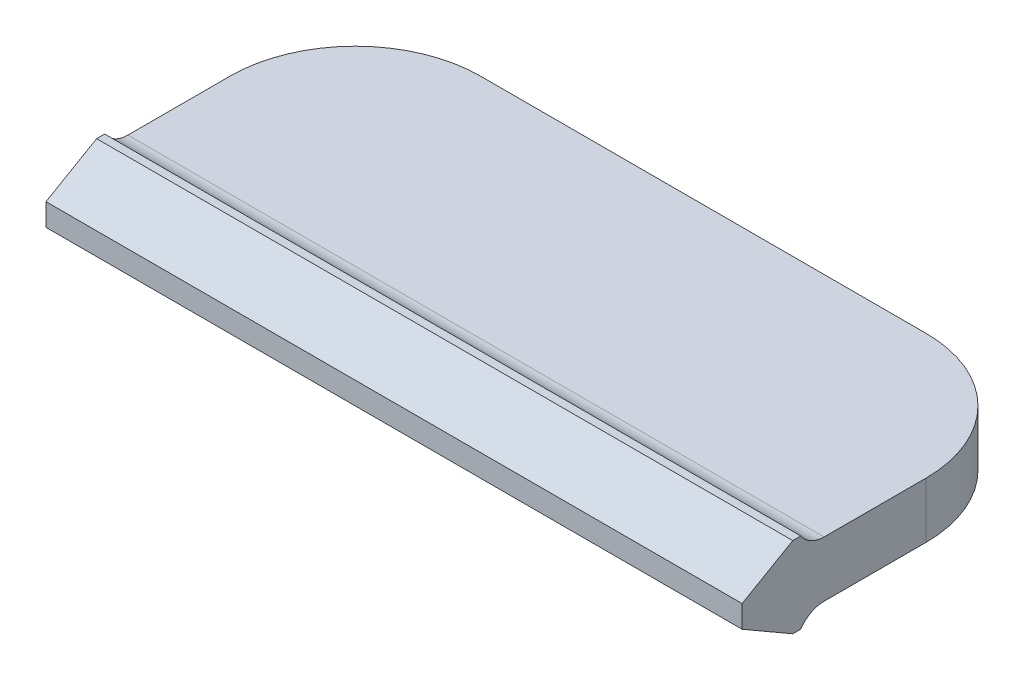
ISO-10303-21;
HEADER;
FILE_DESCRIPTION(('STEP AP214'),'2;1');
FILE_NAME('part.step','',(''),(''),'','','');
FILE_SCHEMA(('AUTOMOTIVE_DESIGN { 1 0 10303 214 1 1 1 1 }'));
ENDSEC;
DATA;
#1=APPLICATION_CONTEXT('core data for automotive mechanical design processes');
#2=APPLICATION_PROTOCOL_DEFINITION('international standard','automotive_design',2000,#1);
#3=PRODUCT_CONTEXT('',#1,'mechanical');
#4=PRODUCT('Part','Part','',(#3));
#5=PRODUCT_RELATED_PRODUCT_CATEGORY('part','',(#4));
#6=PRODUCT_DEFINITION_FORMATION('','',#4);
#7=PRODUCT_DEFINITION_CONTEXT('part definition',#1,'design');
#8=PRODUCT_DEFINITION('design','',#6,#7);
#9=PRODUCT_DEFINITION_SHAPE('','',#8);
#10=(LENGTH_UNIT() NAMED_UNIT(*) SI_UNIT(.MILLI.,.METRE.));
#11=(NAMED_UNIT(*) PLANE_ANGLE_UNIT() SI_UNIT($,.RADIAN.));
#12=(NAMED_UNIT(*) SI_UNIT($,.STERADIAN.) SOLID_ANGLE_UNIT());
#13=UNCERTAINTY_MEASURE_WITH_UNIT(LENGTH_MEASURE(1.E-05),#10,'distance_accuracy_value','');
#14=(GEOMETRIC_REPRESENTATION_CONTEXT(3) GLOBAL_UNCERTAINTY_ASSIGNED_CONTEXT((#13)) GLOBAL_UNIT_ASSIGNED_CONTEXT((#10,
#11,#12)) REPRESENTATION_CONTEXT('',''));
#15=CARTESIAN_POINT('',(0.,0.,0.));
#16=DIRECTION('',(0.,0.,1.));
#17=DIRECTION('',(1.,0.,0.));
#18=AXIS2_PLACEMENT_3D('',#15,#16,#17);
#19=CARTESIAN_POINT('',(25.,0.4,2.10717967697244));
#20=DIRECTION('',(0.,0.,-1.));
#21=DIRECTION('',(0.,1.,0.));
#22=AXIS2_PLACEMENT_3D('',#19,#20,#21);
#23=PLANE('',#22);
#24=DIRECTION('',(0.,-1.,0.));
#25=VECTOR('',#24,1.);
#26=CARTESIAN_POINT('',(0.,0.4,2.10717967697244));
#27=LINE('',#26,#25);
#28=CARTESIAN_POINT('',(0.,0.4,2.10717967697244));
#29=VERTEX_POINT('',#28);
#30=CARTESIAN_POINT('',(0.,-0.4,2.10717967697244));
#31=VERTEX_POINT('',#30);
#32=EDGE_CURVE('E141',#29,#31,#27,.T.);
#33=ORIENTED_EDGE('',*,*,#32,.T.);
#34=DIRECTION('',(-1.,0.,0.));
#35=VECTOR('',#34,1.);
#36=CARTESIAN_POINT('',(25.,-0.4,2.10717967697244));
#37=LINE('',#36,#35);
#38=CARTESIAN_POINT('',(25.,-0.4,2.10717967697244));
#39=VERTEX_POINT('',#38);
#40=EDGE_CURVE('E123',#39,#31,#37,.T.);
#41=ORIENTED_EDGE('',*,*,#40,.F.);
#42=DIRECTION('',(0.,-1.,0.));
#43=VECTOR('',#42,1.);
#44=CARTESIAN_POINT('',(25.,0.4,2.10717967697244));
#45=LINE('',#44,#43);
#46=CARTESIAN_POINT('',(25.,0.4,2.10717967697244));
#47=VERTEX_POINT('',#46);
#48=EDGE_CURVE('E129',#47,#39,#45,.T.);
#49=ORIENTED_EDGE('',*,*,#48,.F.);
#50=DIRECTION('',(-1.,0.,0.));
#51=VECTOR('',#50,1.);
#52=CARTESIAN_POINT('',(25.,0.4,2.10717967697244));
#53=LINE('',#52,#51);
#54=EDGE_CURVE('E200',#47,#29,#53,.T.);
#55=ORIENTED_EDGE('',*,*,#54,.T.);
#56=EDGE_LOOP('',(#33,#41,#49,#55));
#57=FACE_BOUND('',#56,.T.);
#58=ADVANCED_FACE('F32',(#57),#23,.F.);
#59=CARTESIAN_POINT('',(25.,-0.4,2.10717967697244));
#60=DIRECTION('',(0.,0.86602540378444,-0.499999999999998));
#61=DIRECTION('',(0.,0.499999999999998,0.86602540378444));
#62=AXIS2_PLACEMENT_3D('',#59,#60,#61);
#63=PLANE('',#62);
#64=DIRECTION('',(0.,-0.499999999999998,-0.86602540378444));
#65=VECTOR('',#64,1.);
#66=CARTESIAN_POINT('',(0.,-0.4,2.10717967697244));
#67=LINE('',#66,#65);
#68=CARTESIAN_POINT('',(0.,-1.45,0.288526329025113));
#69=VERTEX_POINT('',#68);
#70=EDGE_CURVE('E185',#31,#69,#67,.T.);
#71=ORIENTED_EDGE('',*,*,#70,.T.);
#72=DIRECTION('',(-1.,0.,0.));
#73=VECTOR('',#72,1.);
#74=CARTESIAN_POINT('',(25.,-1.45,0.288526329025113));
#75=LINE('',#74,#73);
#76=CARTESIAN_POINT('',(25.,-1.45,0.288526329025113));
#77=VERTEX_POINT('',#76);
#78=EDGE_CURVE('E126',#77,#69,#75,.T.);
#79=ORIENTED_EDGE('',*,*,#78,.F.);
#80=DIRECTION('',(0.,-0.499999999999998,-0.86602540378444));
#81=VECTOR('',#80,1.);
#82=CARTESIAN_POINT('',(25.,-0.4,2.10717967697244));
#83=LINE('',#82,#81);
#84=EDGE_CURVE('E119',#39,#77,#83,.T.);
#85=ORIENTED_EDGE('',*,*,#84,.F.);
#86=ORIENTED_EDGE('',*,*,#40,.T.);
#87=EDGE_LOOP('',(#71,#79,#85,#86));
#88=FACE_BOUND('',#87,.T.);
#89=ADVANCED_FACE('F121',(#88),#63,.F.);
#90=CARTESIAN_POINT('',(25.,-1.45,0.288526329025113));
#91=DIRECTION('',(0.,1.,0.));
#92=DIRECTION('',(0.,0.,1.));
#93=AXIS2_PLACEMENT_3D('',#90,#91,#92);
#94=PLANE('',#93);
#95=DIRECTION('',(0.,0.,-1.));
#96=VECTOR('',#95,1.);
#97=CARTESIAN_POINT('',(0.,-1.45,0.288526329025113));
#98=LINE('',#97,#96);
#99=CARTESIAN_POINT('',(0.,-1.45,0.));
#100=VERTEX_POINT('',#99);
#101=EDGE_CURVE('E180',#69,#100,#98,.T.);
#102=ORIENTED_EDGE('',*,*,#101,.T.);
#103=DIRECTION('',(-1.,0.,0.));
#104=VECTOR('',#103,1.);
#105=CARTESIAN_POINT('',(25.,-1.45,0.));
#106=LINE('',#105,#104);
#107=CARTESIAN_POINT('',(25.,-1.45,0.));
#108=VERTEX_POINT('',#107);
#109=EDGE_CURVE('E147',#108,#100,#106,.T.);
#110=ORIENTED_EDGE('',*,*,#109,.F.);
#111=DIRECTION('',(0.,0.,-1.));
#112=VECTOR('',#111,1.);
#113=CARTESIAN_POINT('',(25.,-1.45,0.288526329025113));
#114=LINE('',#113,#112);
#115=EDGE_CURVE('E128',#77,#108,#114,.T.);
#116=ORIENTED_EDGE('',*,*,#115,.F.);
#117=ORIENTED_EDGE('',*,*,#78,.T.);
#118=EDGE_LOOP('',(#102,#110,#116,#117));
#119=FACE_BOUND('',#118,.T.);
#120=ADVANCED_FACE('F184',(#119),#94,.F.);
#121=CARTESIAN_POINT('',(25.,-1.,0.));
#122=DIRECTION('',(0.,1.,0.));
#123=DIRECTION('',(0.,0.,1.));
#124=AXIS2_PLACEMENT_3D('',#121,#122,#123);
#125=PLANE('',#124);
#126=DIRECTION('',(0.,0.,-1.));
#127=VECTOR('',#126,1.);
#128=CARTESIAN_POINT('',(25.,-1.,0.));
#129=LINE('',#128,#127);
#130=CARTESIAN_POINT('',(25.,-1.,-0.835164654424503));
#131=VERTEX_POINT('',#130);
#132=CARTESIAN_POINT('',(25.,-1.,-4.5));
#133=VERTEX_POINT('',#132);
#134=EDGE_CURVE('E217',#131,#133,#129,.T.);
#135=ORIENTED_EDGE('',*,*,#134,.F.);
#136=DIRECTION('',(-1.,0.,0.));
#137=VECTOR('',#136,1.);
#138=CARTESIAN_POINT('',(25.,-1.,-0.835164654424503));
#139=LINE('',#138,#137);
#140=CARTESIAN_POINT('',(0.,-1.,-0.835164654424503));
#141=VERTEX_POINT('',#140);
#142=EDGE_CURVE('E169',#131,#141,#139,.T.);
#143=ORIENTED_EDGE('',*,*,#142,.T.);
#144=DIRECTION('',(0.,0.,-1.));
#145=VECTOR('',#144,1.);
#146=CARTESIAN_POINT('',(0.,-1.,0.));
#147=LINE('',#146,#145);
#148=CARTESIAN_POINT('',(0.,-1.,-4.5));
#149=VERTEX_POINT('',#148);
#150=EDGE_CURVE('E181',#141,#149,#147,.T.);
#151=ORIENTED_EDGE('',*,*,#150,.T.);
#152=CARTESIAN_POINT('',(4.5,-1.,-4.5));
#153=DIRECTION('',(0.,1.,0.));
#154=DIRECTION('',(0.,0.,1.));
#155=AXIS2_PLACEMENT_3D('',#152,#153,#154);
#156=CIRCLE('',#155,4.5);
#157=CARTESIAN_POINT('',(4.5,-0.999999999999999,-9.));
#158=VERTEX_POINT('',#157);
#159=EDGE_CURVE('E159',#149,#158,#156,.F.);
#160=ORIENTED_EDGE('',*,*,#159,.T.);
#161=DIRECTION('',(-1.,0.,0.));
#162=VECTOR('',#161,1.);
#163=CARTESIAN_POINT('',(25.,-0.999999999999999,-9.));
#164=LINE('',#163,#162);
#165=CARTESIAN_POINT('',(20.5,-0.999999999999999,-9.));
#166=VERTEX_POINT('',#165);
#167=EDGE_CURVE('E187',#166,#158,#164,.T.);
#168=ORIENTED_EDGE('',*,*,#167,.F.);
#169=CARTESIAN_POINT('',(20.5,-1.,-4.5));
#170=DIRECTION('',(0.,1.,0.));
#171=DIRECTION('',(0.,0.,1.));
#172=AXIS2_PLACEMENT_3D('',#169,#170,#171);
#173=CIRCLE('',#172,4.5);
#174=EDGE_CURVE('E161',#166,#133,#173,.F.);
#175=ORIENTED_EDGE('',*,*,#174,.T.);
#176=EDGE_LOOP('',(#135,#143,#151,#160,#168,#175));
#177=FACE_BOUND('',#176,.T.);
#178=ADVANCED_FACE('F224',(#177),#125,.F.);
#179=CARTESIAN_POINT('',(25.,-0.999999999999999,-9.));
#180=DIRECTION('',(0.,0.,1.));
#181=DIRECTION('',(1.,0.,0.));
#182=AXIS2_PLACEMENT_3D('',#179,#180,#181);
#183=PLANE('',#182);
#184=DIRECTION('',(-1.,0.,0.));
#185=VECTOR('',#184,1.);
#186=CARTESIAN_POINT('',(25.,0.999999999999999,-9.));
#187=LINE('',#186,#185);
#188=CARTESIAN_POINT('',(20.5,0.999999999999999,-9.));
#189=VERTEX_POINT('',#188);
#190=CARTESIAN_POINT('',(4.5,0.999999999999999,-9.));
#191=VERTEX_POINT('',#190);
#192=EDGE_CURVE('E189',#189,#191,#187,.T.);
#193=ORIENTED_EDGE('',*,*,#192,.F.);
#194=DIRECTION('',(0.,1.,0.));
#195=VECTOR('',#194,1.);
#196=CARTESIAN_POINT('',(20.5,-0.999999999999999,-9.));
#197=LINE('',#196,#195);
#198=EDGE_CURVE('E157',#189,#166,#197,.F.);
#199=ORIENTED_EDGE('',*,*,#198,.T.);
#200=ORIENTED_EDGE('',*,*,#167,.T.);
#201=DIRECTION('',(0.,1.,0.));
#202=VECTOR('',#201,1.);
#203=CARTESIAN_POINT('',(4.5,-0.999999999999999,-9.));
#204=LINE('',#203,#202);
#205=EDGE_CURVE('E154',#158,#191,#204,.T.);
#206=ORIENTED_EDGE('',*,*,#205,.T.);
#207=EDGE_LOOP('',(#193,#199,#200,#206));
#208=FACE_BOUND('',#207,.T.);
#209=ADVANCED_FACE('F232',(#208),#183,.F.);
#210=CARTESIAN_POINT('',(25.,0.999999999999999,-9.));
#211=DIRECTION('',(0.,-1.,0.));
#212=DIRECTION('',(0.,0.,-1.));
#213=AXIS2_PLACEMENT_3D('',#210,#211,#212);
#214=PLANE('',#213);
#215=DIRECTION('',(0.,0.,1.));
#216=VECTOR('',#215,1.);
#217=CARTESIAN_POINT('',(0.,0.999999999999999,-9.));
#218=LINE('',#217,#216);
#219=CARTESIAN_POINT('',(0.,1.,-4.5));
#220=VERTEX_POINT('',#219);
#221=CARTESIAN_POINT('',(0.,1.,-0.835164654424503));
#222=VERTEX_POINT('',#221);
#223=EDGE_CURVE('E205',#220,#222,#218,.T.);
#224=ORIENTED_EDGE('',*,*,#223,.T.);
#225=DIRECTION('',(1.,0.,0.));
#226=VECTOR('',#225,1.);
#227=CARTESIAN_POINT('',(25.,1.,-0.835164654424503));
#228=LINE('',#227,#226);
#229=CARTESIAN_POINT('',(25.,1.,-0.835164654424503));
#230=VERTEX_POINT('',#229);
#231=EDGE_CURVE('E167',#222,#230,#228,.T.);
#232=ORIENTED_EDGE('',*,*,#231,.T.);
#233=DIRECTION('',(0.,0.,1.));
#234=VECTOR('',#233,1.);
#235=CARTESIAN_POINT('',(25.,0.999999999999999,-9.));
#236=LINE('',#235,#234);
#237=CARTESIAN_POINT('',(25.,1.,-4.5));
#238=VERTEX_POINT('',#237);
#239=EDGE_CURVE('E214',#238,#230,#236,.T.);
#240=ORIENTED_EDGE('',*,*,#239,.F.);
#241=CARTESIAN_POINT('',(20.5,1.,-4.5));
#242=DIRECTION('',(0.,-1.,0.));
#243=DIRECTION('',(0.,0.,-1.));
#244=AXIS2_PLACEMENT_3D('',#241,#242,#243);
#245=CIRCLE('',#244,4.5);
#246=EDGE_CURVE('E152',#238,#189,#245,.F.);
#247=ORIENTED_EDGE('',*,*,#246,.T.);
#248=ORIENTED_EDGE('',*,*,#192,.T.);
#249=CARTESIAN_POINT('',(4.5,0.999999999999999,-4.5));
#250=DIRECTION('',(0.,-1.,0.));
#251=DIRECTION('',(0.,0.,-1.));
#252=AXIS2_PLACEMENT_3D('',#249,#250,#251);
#253=CIRCLE('',#252,4.5);
#254=EDGE_CURVE('E145',#191,#220,#253,.F.);
#255=ORIENTED_EDGE('',*,*,#254,.T.);
#256=EDGE_LOOP('',(#224,#232,#240,#247,#248,#255));
#257=FACE_BOUND('',#256,.T.);
#258=ADVANCED_FACE('F230',(#257),#214,.F.);
#259=CARTESIAN_POINT('',(25.,1.45,0.));
#260=DIRECTION('',(0.,-1.,0.));
#261=DIRECTION('',(0.,0.,-1.));
#262=AXIS2_PLACEMENT_3D('',#259,#260,#261);
#263=PLANE('',#262);
#264=DIRECTION('',(0.,0.,1.));
#265=VECTOR('',#264,1.);
#266=CARTESIAN_POINT('',(0.,1.45,0.));
#267=LINE('',#266,#265);
#268=CARTESIAN_POINT('',(0.,1.45,0.));
#269=VERTEX_POINT('',#268);
#270=CARTESIAN_POINT('',(0.,1.45,0.288526329025114));
#271=VERTEX_POINT('',#270);
#272=EDGE_CURVE('E203',#269,#271,#267,.T.);
#273=ORIENTED_EDGE('',*,*,#272,.T.);
#274=DIRECTION('',(-1.,0.,0.));
#275=VECTOR('',#274,1.);
#276=CARTESIAN_POINT('',(25.,1.45,0.288526329025114));
#277=LINE('',#276,#275);
#278=CARTESIAN_POINT('',(25.,1.45,0.288526329025114));
#279=VERTEX_POINT('',#278);
#280=EDGE_CURVE('E197',#279,#271,#277,.T.);
#281=ORIENTED_EDGE('',*,*,#280,.F.);
#282=DIRECTION('',(0.,0.,1.));
#283=VECTOR('',#282,1.);
#284=CARTESIAN_POINT('',(25.,1.45,0.));
#285=LINE('',#284,#283);
#286=CARTESIAN_POINT('',(25.,1.45,0.));
#287=VERTEX_POINT('',#286);
#288=EDGE_CURVE('E212',#287,#279,#285,.T.);
#289=ORIENTED_EDGE('',*,*,#288,.F.);
#290=DIRECTION('',(-1.,0.,0.));
#291=VECTOR('',#290,1.);
#292=CARTESIAN_POINT('',(25.,1.45,0.));
#293=LINE('',#292,#291);
#294=EDGE_CURVE('E194',#287,#269,#293,.T.);
#295=ORIENTED_EDGE('',*,*,#294,.T.);
#296=EDGE_LOOP('',(#273,#281,#289,#295));
#297=FACE_BOUND('',#296,.T.);
#298=ADVANCED_FACE('F247',(#297),#263,.F.);
#299=CARTESIAN_POINT('',(25.,1.45,0.288526329025114));
#300=DIRECTION('',(0.,-0.86602540378444,-0.499999999999998));
#301=DIRECTION('',(0.,0.499999999999998,-0.86602540378444));
#302=AXIS2_PLACEMENT_3D('',#299,#300,#301);
#303=PLANE('',#302);
#304=DIRECTION('',(0.,-0.499999999999998,0.86602540378444));
#305=VECTOR('',#304,1.);
#306=CARTESIAN_POINT('',(0.,1.45,0.288526329025114));
#307=LINE('',#306,#305);
#308=EDGE_CURVE('E138',#271,#29,#307,.T.);
#309=ORIENTED_EDGE('',*,*,#308,.T.);
#310=ORIENTED_EDGE('',*,*,#54,.F.);
#311=DIRECTION('',(0.,-0.499999999999998,0.86602540378444));
#312=VECTOR('',#311,1.);
#313=CARTESIAN_POINT('',(25.,1.45,0.288526329025114));
#314=LINE('',#313,#312);
#315=EDGE_CURVE('E134',#279,#47,#314,.T.);
#316=ORIENTED_EDGE('',*,*,#315,.F.);
#317=ORIENTED_EDGE('',*,*,#280,.T.);
#318=EDGE_LOOP('',(#309,#310,#316,#317));
#319=FACE_BOUND('',#318,.T.);
#320=ADVANCED_FACE('F250',(#319),#303,.F.);
#321=CARTESIAN_POINT('',(25.,0.,0.));
#322=DIRECTION('',(1.,0.,0.));
#323=DIRECTION('',(0.,0.,-1.));
#324=AXIS2_PLACEMENT_3D('',#321,#322,#323);
#325=PLANE('',#324);
#326=ORIENTED_EDGE('',*,*,#115,.T.);
#327=CARTESIAN_POINT('',(25.,-2.,-0.835164654424504));
#328=DIRECTION('',(1.,0.,0.));
#329=DIRECTION('',(0.,0.,-1.));
#330=AXIS2_PLACEMENT_3D('',#327,#328,#329);
#331=CIRCLE('',#330,1.);
#332=EDGE_CURVE('E11',#108,#131,#331,.F.);
#333=ORIENTED_EDGE('',*,*,#332,.T.);
#334=ORIENTED_EDGE('',*,*,#134,.T.);
#335=DIRECTION('',(0.,1.,0.));
#336=VECTOR('',#335,1.);
#337=CARTESIAN_POINT('',(25.,0.999999999999999,-4.5));
#338=LINE('',#337,#336);
#339=EDGE_CURVE('E142',#133,#238,#338,.T.);
#340=ORIENTED_EDGE('',*,*,#339,.T.);
#341=ORIENTED_EDGE('',*,*,#239,.T.);
#342=CARTESIAN_POINT('',(25.,2.,-0.835164654424504));
#343=DIRECTION('',(1.,0.,0.));
#344=DIRECTION('',(0.,0.,-1.));
#345=AXIS2_PLACEMENT_3D('',#342,#343,#344);
#346=CIRCLE('',#345,1.);
#347=EDGE_CURVE('E173',#230,#287,#346,.F.);
#348=ORIENTED_EDGE('',*,*,#347,.T.);
#349=ORIENTED_EDGE('',*,*,#288,.T.);
#350=ORIENTED_EDGE('',*,*,#315,.T.);
#351=ORIENTED_EDGE('',*,*,#48,.T.);
#352=ORIENTED_EDGE('',*,*,#84,.T.);
#353=EDGE_LOOP('',(#326,#333,#334,#340,#341,#348,#349,#350,#351,#352));
#354=FACE_BOUND('',#353,.T.);
#355=ADVANCED_FACE('F132',(#354),#325,.T.);
#356=CARTESIAN_POINT('',(0.,0.,0.));
#357=DIRECTION('',(1.,0.,0.));
#358=DIRECTION('',(0.,0.,-1.));
#359=AXIS2_PLACEMENT_3D('',#356,#357,#358);
#360=PLANE('',#359);
#361=ORIENTED_EDGE('',*,*,#223,.F.);
#362=DIRECTION('',(0.,1.,0.));
#363=VECTOR('',#362,1.);
#364=CARTESIAN_POINT('',(0.,0.,-4.5));
#365=LINE('',#364,#363);
#366=EDGE_CURVE('E164',#220,#149,#365,.F.);
#367=ORIENTED_EDGE('',*,*,#366,.T.);
#368=ORIENTED_EDGE('',*,*,#150,.F.);
#369=CARTESIAN_POINT('',(0.,-2.,-0.835164654424504));
#370=DIRECTION('',(1.,0.,0.));
#371=DIRECTION('',(0.,0.,-1.));
#372=AXIS2_PLACEMENT_3D('',#369,#370,#371);
#373=CIRCLE('',#372,1.);
#374=EDGE_CURVE('E40',#141,#100,#373,.T.);
#375=ORIENTED_EDGE('',*,*,#374,.T.);
#376=ORIENTED_EDGE('',*,*,#101,.F.);
#377=ORIENTED_EDGE('',*,*,#70,.F.);
#378=ORIENTED_EDGE('',*,*,#32,.F.);
#379=ORIENTED_EDGE('',*,*,#308,.F.);
#380=ORIENTED_EDGE('',*,*,#272,.F.);
#381=CARTESIAN_POINT('',(0.,2.,-0.835164654424504));
#382=DIRECTION('',(1.,0.,0.));
#383=DIRECTION('',(0.,0.,-1.));
#384=AXIS2_PLACEMENT_3D('',#381,#382,#383);
#385=CIRCLE('',#384,1.);
#386=EDGE_CURVE('E171',#269,#222,#385,.T.);
#387=ORIENTED_EDGE('',*,*,#386,.T.);
#388=EDGE_LOOP('',(#361,#367,#368,#375,#376,#377,#378,#379,#380,#387));
#389=FACE_BOUND('',#388,.T.);
#390=ADVANCED_FACE('F179',(#389),#360,.F.);
#391=CARTESIAN_POINT('',(20.5,0.,-4.5));
#392=DIRECTION('',(0.,-1.,0.));
#393=DIRECTION('',(0.,0.,-1.));
#394=AXIS2_PLACEMENT_3D('',#391,#392,#393);
#395=CYLINDRICAL_SURFACE('',#394,4.5);
#396=ORIENTED_EDGE('',*,*,#174,.F.);
#397=ORIENTED_EDGE('',*,*,#198,.F.);
#398=ORIENTED_EDGE('',*,*,#246,.F.);
#399=ORIENTED_EDGE('',*,*,#339,.F.);
#400=EDGE_LOOP('',(#396,#397,#398,#399));
#401=FACE_BOUND('',#400,.T.);
#402=ADVANCED_FACE('F227',(#401),#395,.T.);
#403=CARTESIAN_POINT('',(4.5,-0.999999999999999,-4.5));
#404=DIRECTION('',(0.,1.,0.));
#405=DIRECTION('',(0.,0.,1.));
#406=AXIS2_PLACEMENT_3D('',#403,#404,#405);
#407=CYLINDRICAL_SURFACE('',#406,4.5);
#408=ORIENTED_EDGE('',*,*,#159,.F.);
#409=ORIENTED_EDGE('',*,*,#366,.F.);
#410=ORIENTED_EDGE('',*,*,#254,.F.);
#411=ORIENTED_EDGE('',*,*,#205,.F.);
#412=EDGE_LOOP('',(#408,#409,#410,#411));
#413=FACE_BOUND('',#412,.T.);
#414=ADVANCED_FACE('F236',(#413),#407,.T.);
#415=CARTESIAN_POINT('',(25.,2.,-0.835164654424504));
#416=DIRECTION('',(1.,0.,0.));
#417=DIRECTION('',(0.,0.,-1.));
#418=AXIS2_PLACEMENT_3D('',#415,#416,#417);
#419=CYLINDRICAL_SURFACE('',#418,1.);
#420=ORIENTED_EDGE('',*,*,#347,.F.);
#421=ORIENTED_EDGE('',*,*,#231,.F.);
#422=ORIENTED_EDGE('',*,*,#386,.F.);
#423=ORIENTED_EDGE('',*,*,#294,.F.);
#424=EDGE_LOOP('',(#420,#421,#422,#423));
#425=FACE_BOUND('',#424,.T.);
#426=ADVANCED_FACE('F244',(#425),#419,.F.);
#427=CARTESIAN_POINT('',(25.,-2.,-0.835164654424504));
#428=DIRECTION('',(-1.,0.,0.));
#429=DIRECTION('',(0.,0.,1.));
#430=AXIS2_PLACEMENT_3D('',#427,#428,#429);
#431=CYLINDRICAL_SURFACE('',#430,1.);
#432=ORIENTED_EDGE('',*,*,#332,.F.);
#433=ORIENTED_EDGE('',*,*,#109,.T.);
#434=ORIENTED_EDGE('',*,*,#374,.F.);
#435=ORIENTED_EDGE('',*,*,#142,.F.);
#436=EDGE_LOOP('',(#432,#433,#434,#435));
#437=FACE_BOUND('',#436,.T.);
#438=ADVANCED_FACE('F34',(#437),#431,.F.);
#439=CLOSED_SHELL('',(#58,#89,#120,#178,#209,#258,#298,#320,#355,#390,#402,#414,#426,#438));
#440=MANIFOLD_SOLID_BREP('B2',#439);
#441=ADVANCED_BREP_SHAPE_REPRESENTATION('',(#18,#440),#14);
#442=SHAPE_DEFINITION_REPRESENTATION(#9,#441);
ENDSEC;
END-ISO-10303-21;
